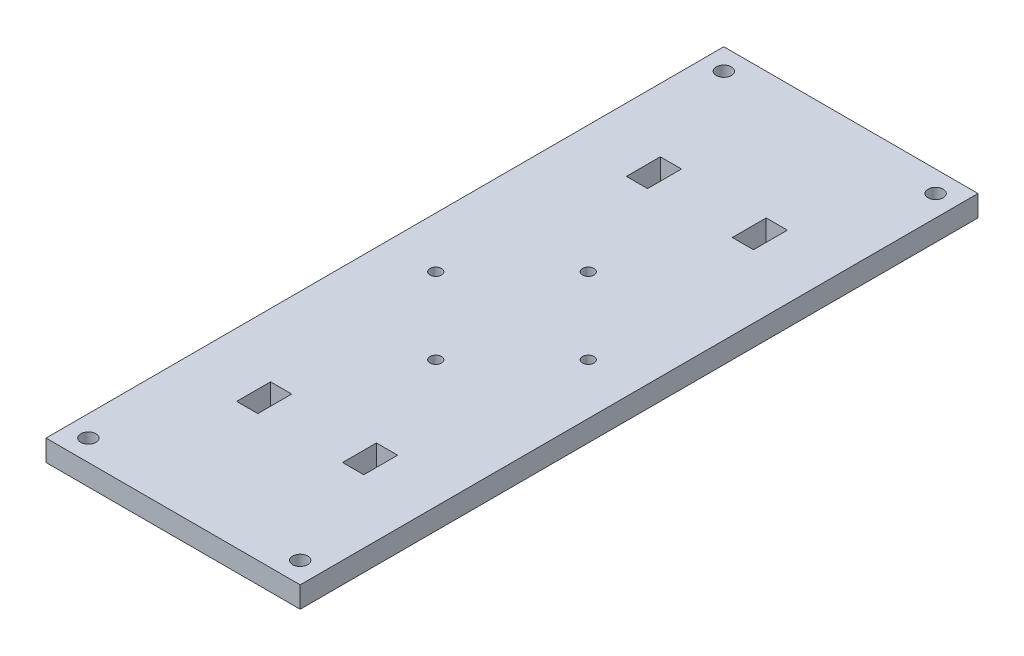
ISO-10303-21;
HEADER;
FILE_DESCRIPTION(('STEP AP214'),'2;1');
FILE_NAME('part.step','',(''),(''),'','','');
FILE_SCHEMA(('AUTOMOTIVE_DESIGN { 1 0 10303 214 1 1 1 1 }'));
ENDSEC;
DATA;
#1=APPLICATION_CONTEXT('core data for automotive mechanical design processes');
#2=APPLICATION_PROTOCOL_DEFINITION('international standard','automotive_design',2000,#1);
#3=PRODUCT_CONTEXT('',#1,'mechanical');
#4=PRODUCT('Part','Part','',(#3));
#5=PRODUCT_RELATED_PRODUCT_CATEGORY('part','',(#4));
#6=PRODUCT_DEFINITION_FORMATION('','',#4);
#7=PRODUCT_DEFINITION_CONTEXT('part definition',#1,'design');
#8=PRODUCT_DEFINITION('design','',#6,#7);
#9=PRODUCT_DEFINITION_SHAPE('','',#8);
#10=(LENGTH_UNIT() NAMED_UNIT(*) SI_UNIT(.MILLI.,.METRE.));
#11=(NAMED_UNIT(*) PLANE_ANGLE_UNIT() SI_UNIT($,.RADIAN.));
#12=(NAMED_UNIT(*) SI_UNIT($,.STERADIAN.) SOLID_ANGLE_UNIT());
#13=UNCERTAINTY_MEASURE_WITH_UNIT(LENGTH_MEASURE(1.E-05),#10,'distance_accuracy_value','');
#14=(GEOMETRIC_REPRESENTATION_CONTEXT(3) GLOBAL_UNCERTAINTY_ASSIGNED_CONTEXT((#13)) GLOBAL_UNIT_ASSIGNED_CONTEXT((#10,
#11,#12)) REPRESENTATION_CONTEXT('',''));
#15=CARTESIAN_POINT('',(0.,0.,0.));
#16=DIRECTION('',(0.,0.,1.));
#17=DIRECTION('',(1.,0.,0.));
#18=AXIS2_PLACEMENT_3D('',#15,#16,#17);
#19=CARTESIAN_POINT('',(-22.707182320442,5.,-67.3756906077348));
#20=DIRECTION('',(1.,0.,0.));
#21=DIRECTION('',(0.,0.,-1.));
#22=AXIS2_PLACEMENT_3D('',#19,#20,#21);
#23=PLANE('',#22);
#24=DIRECTION('',(0.,0.,1.));
#25=VECTOR('',#24,1.);
#26=CARTESIAN_POINT('',(-22.707182320442,0.,-67.3756906077348));
#27=LINE('',#26,#25);
#28=CARTESIAN_POINT('',(-22.707182320442,0.,-67.3756906077348));
#29=VERTEX_POINT('',#28);
#30=CARTESIAN_POINT('',(-22.707182320442,0.,92.6243093922652));
#31=VERTEX_POINT('',#30);
#32=EDGE_CURVE('E350',#29,#31,#27,.T.);
#33=ORIENTED_EDGE('',*,*,#32,.T.);
#34=DIRECTION('',(0.,-1.,0.));
#35=VECTOR('',#34,1.);
#36=CARTESIAN_POINT('',(-22.707182320442,5.,92.6243093922652));
#37=LINE('',#36,#35);
#38=CARTESIAN_POINT('',(-22.707182320442,5.,92.6243093922652));
#39=VERTEX_POINT('',#38);
#40=EDGE_CURVE('E11',#39,#31,#37,.T.);
#41=ORIENTED_EDGE('',*,*,#40,.F.);
#42=DIRECTION('',(0.,0.,1.));
#43=VECTOR('',#42,1.);
#44=CARTESIAN_POINT('',(-22.707182320442,5.,-67.3756906077348));
#45=LINE('',#44,#43);
#46=CARTESIAN_POINT('',(-22.707182320442,5.,-67.3756906077348));
#47=VERTEX_POINT('',#46);
#48=EDGE_CURVE('E353',#47,#39,#45,.T.);
#49=ORIENTED_EDGE('',*,*,#48,.F.);
#50=DIRECTION('',(0.,-1.,0.));
#51=VECTOR('',#50,1.);
#52=CARTESIAN_POINT('',(-22.707182320442,5.,-67.3756906077348));
#53=LINE('',#52,#51);
#54=EDGE_CURVE('E365',#47,#29,#53,.T.);
#55=ORIENTED_EDGE('',*,*,#54,.T.);
#56=EDGE_LOOP('',(#33,#41,#49,#55));
#57=FACE_BOUND('',#56,.T.);
#58=ADVANCED_FACE('F33',(#57),#23,.F.);
#59=CARTESIAN_POINT('',(-22.707182320442,5.,92.6243093922652));
#60=DIRECTION('',(0.,0.,-1.));
#61=DIRECTION('',(-1.,0.,0.));
#62=AXIS2_PLACEMENT_3D('',#59,#60,#61);
#63=PLANE('',#62);
#64=DIRECTION('',(1.,0.,0.));
#65=VECTOR('',#64,1.);
#66=CARTESIAN_POINT('',(-22.707182320442,0.,92.6243093922652));
#67=LINE('',#66,#65);
#68=CARTESIAN_POINT('',(37.292817679558,0.,92.6243093922652));
#69=VERTEX_POINT('',#68);
#70=EDGE_CURVE('E368',#31,#69,#67,.T.);
#71=ORIENTED_EDGE('',*,*,#70,.T.);
#72=DIRECTION('',(0.,-1.,0.));
#73=VECTOR('',#72,1.);
#74=CARTESIAN_POINT('',(37.292817679558,5.,92.6243093922652));
#75=LINE('',#74,#73);
#76=CARTESIAN_POINT('',(37.292817679558,5.,92.6243093922652));
#77=VERTEX_POINT('',#76);
#78=EDGE_CURVE('E40',#77,#69,#75,.T.);
#79=ORIENTED_EDGE('',*,*,#78,.F.);
#80=DIRECTION('',(1.,0.,0.));
#81=VECTOR('',#80,1.);
#82=CARTESIAN_POINT('',(-22.707182320442,5.,92.6243093922652));
#83=LINE('',#82,#81);
#84=EDGE_CURVE('E356',#39,#77,#83,.T.);
#85=ORIENTED_EDGE('',*,*,#84,.F.);
#86=ORIENTED_EDGE('',*,*,#40,.T.);
#87=EDGE_LOOP('',(#71,#79,#85,#86));
#88=FACE_BOUND('',#87,.T.);
#89=ADVANCED_FACE('F384',(#88),#63,.F.);
#90=CARTESIAN_POINT('',(37.292817679558,5.,-67.3756906077348));
#91=DIRECTION('',(1.,0.,0.));
#92=DIRECTION('',(0.,0.,-1.));
#93=AXIS2_PLACEMENT_3D('',#90,#91,#92);
#94=PLANE('',#93);
#95=DIRECTION('',(0.,0.,1.));
#96=VECTOR('',#95,1.);
#97=CARTESIAN_POINT('',(37.292817679558,0.,-67.3756906077348));
#98=LINE('',#97,#96);
#99=CARTESIAN_POINT('',(37.292817679558,0.,-67.3756906077348));
#100=VERTEX_POINT('',#99);
#101=EDGE_CURVE('E371',#100,#69,#98,.T.);
#102=ORIENTED_EDGE('',*,*,#101,.F.);
#103=DIRECTION('',(0.,-1.,0.));
#104=VECTOR('',#103,1.);
#105=CARTESIAN_POINT('',(37.292817679558,5.,-67.3756906077348));
#106=LINE('',#105,#104);
#107=CARTESIAN_POINT('',(37.292817679558,5.,-67.3756906077348));
#108=VERTEX_POINT('',#107);
#109=EDGE_CURVE('E377',#108,#100,#106,.T.);
#110=ORIENTED_EDGE('',*,*,#109,.F.);
#111=DIRECTION('',(0.,0.,1.));
#112=VECTOR('',#111,1.);
#113=CARTESIAN_POINT('',(37.292817679558,5.,-67.3756906077348));
#114=LINE('',#113,#112);
#115=EDGE_CURVE('E359',#108,#77,#114,.T.);
#116=ORIENTED_EDGE('',*,*,#115,.T.);
#117=ORIENTED_EDGE('',*,*,#78,.T.);
#118=EDGE_LOOP('',(#102,#110,#116,#117));
#119=FACE_BOUND('',#118,.T.);
#120=ADVANCED_FACE('F381',(#119),#94,.T.);
#121=CARTESIAN_POINT('',(-22.707182320442,5.,-67.3756906077348));
#122=DIRECTION('',(0.,0.,-1.));
#123=DIRECTION('',(-1.,0.,0.));
#124=AXIS2_PLACEMENT_3D('',#121,#122,#123);
#125=PLANE('',#124);
#126=DIRECTION('',(1.,0.,0.));
#127=VECTOR('',#126,1.);
#128=CARTESIAN_POINT('',(-22.707182320442,0.,-67.3756906077348));
#129=LINE('',#128,#127);
#130=EDGE_CURVE('E357',#29,#100,#129,.T.);
#131=ORIENTED_EDGE('',*,*,#130,.F.);
#132=ORIENTED_EDGE('',*,*,#54,.F.);
#133=DIRECTION('',(1.,0.,0.));
#134=VECTOR('',#133,1.);
#135=CARTESIAN_POINT('',(-22.707182320442,5.,-67.3756906077348));
#136=LINE('',#135,#134);
#137=EDGE_CURVE('E362',#47,#108,#136,.T.);
#138=ORIENTED_EDGE('',*,*,#137,.T.);
#139=ORIENTED_EDGE('',*,*,#109,.T.);
#140=EDGE_LOOP('',(#131,#132,#138,#139));
#141=FACE_BOUND('',#140,.T.);
#142=ADVANCED_FACE('F390',(#141),#125,.T.);
#143=CARTESIAN_POINT('',(0.,5.,0.));
#144=DIRECTION('',(0.,1.,0.));
#145=DIRECTION('',(0.,0.,1.));
#146=AXIS2_PLACEMENT_3D('',#143,#144,#145);
#147=PLANE('',#146);
#148=DIRECTION('',(0.,0.,-1.));
#149=VECTOR('',#148,1.);
#150=CARTESIAN_POINT('',(-2.70718232044199,5.,54.6243093922652));
#151=LINE('',#150,#149);
#152=CARTESIAN_POINT('',(-2.70718232044199,5.,62.6243093922652));
#153=VERTEX_POINT('',#152);
#154=CARTESIAN_POINT('',(-2.70718232044199,5.,54.6243093922652));
#155=VERTEX_POINT('',#154);
#156=EDGE_CURVE('E47',#153,#155,#151,.T.);
#157=ORIENTED_EDGE('',*,*,#156,.F.);
#158=DIRECTION('',(1.,0.,0.));
#159=VECTOR('',#158,1.);
#160=CARTESIAN_POINT('',(-2.70718232044199,5.,62.6243093922652));
#161=LINE('',#160,#159);
#162=CARTESIAN_POINT('',(-7.70718232044199,5.,62.6243093922652));
#163=VERTEX_POINT('',#162);
#164=EDGE_CURVE('E248',#163,#153,#161,.T.);
#165=ORIENTED_EDGE('',*,*,#164,.F.);
#166=DIRECTION('',(0.,0.,1.));
#167=VECTOR('',#166,1.);
#168=CARTESIAN_POINT('',(-7.70718232044199,5.,54.6243093922652));
#169=LINE('',#168,#167);
#170=CARTESIAN_POINT('',(-7.70718232044199,5.,54.6243093922652));
#171=VERTEX_POINT('',#170);
#172=EDGE_CURVE('E262',#171,#163,#169,.T.);
#173=ORIENTED_EDGE('',*,*,#172,.F.);
#174=DIRECTION('',(-1.,0.,0.));
#175=VECTOR('',#174,1.);
#176=CARTESIAN_POINT('',(-2.70718232044199,5.,54.6243093922652));
#177=LINE('',#176,#175);
#178=EDGE_CURVE('E259',#155,#171,#177,.T.);
#179=ORIENTED_EDGE('',*,*,#178,.F.);
#180=EDGE_LOOP('',(#157,#165,#173,#179));
#181=FACE_BOUND('',#180,.T.);
#182=DIRECTION('',(0.,0.,-1.));
#183=VECTOR('',#182,1.);
#184=CARTESIAN_POINT('',(22.292817679558,5.,62.6243093922652));
#185=LINE('',#184,#183);
#186=CARTESIAN_POINT('',(22.292817679558,5.,62.6243093922652));
#187=VERTEX_POINT('',#186);
#188=CARTESIAN_POINT('',(22.292817679558,5.,54.6243093922652));
#189=VERTEX_POINT('',#188);
#190=EDGE_CURVE('E55',#187,#189,#185,.T.);
#191=ORIENTED_EDGE('',*,*,#190,.F.);
#192=DIRECTION('',(1.,0.,0.));
#193=VECTOR('',#192,1.);
#194=CARTESIAN_POINT('',(22.292817679558,5.,62.6243093922652));
#195=LINE('',#194,#193);
#196=CARTESIAN_POINT('',(17.292817679558,5.,62.6243093922652));
#197=VERTEX_POINT('',#196);
#198=EDGE_CURVE('E218',#197,#187,#195,.T.);
#199=ORIENTED_EDGE('',*,*,#198,.F.);
#200=DIRECTION('',(0.,0.,1.));
#201=VECTOR('',#200,1.);
#202=CARTESIAN_POINT('',(17.292817679558,5.,62.6243093922652));
#203=LINE('',#202,#201);
#204=CARTESIAN_POINT('',(17.292817679558,5.,54.6243093922652));
#205=VERTEX_POINT('',#204);
#206=EDGE_CURVE('E233',#205,#197,#203,.T.);
#207=ORIENTED_EDGE('',*,*,#206,.F.);
#208=DIRECTION('',(-1.,0.,0.));
#209=VECTOR('',#208,1.);
#210=CARTESIAN_POINT('',(22.292817679558,5.,54.6243093922652));
#211=LINE('',#210,#209);
#212=EDGE_CURVE('E229',#189,#205,#211,.T.);
#213=ORIENTED_EDGE('',*,*,#212,.F.);
#214=EDGE_LOOP('',(#191,#199,#207,#213));
#215=FACE_BOUND('',#214,.T.);
#216=DIRECTION('',(0.,0.,1.));
#217=VECTOR('',#216,1.);
#218=CARTESIAN_POINT('',(17.292817679558,5.,-37.3756906077348));
#219=LINE('',#218,#217);
#220=CARTESIAN_POINT('',(17.292817679558,5.,-37.3756906077348));
#221=VERTEX_POINT('',#220);
#222=CARTESIAN_POINT('',(17.292817679558,5.,-29.3756906077348));
#223=VERTEX_POINT('',#222);
#224=EDGE_CURVE('E176',#221,#223,#219,.T.);
#225=ORIENTED_EDGE('',*,*,#224,.F.);
#226=DIRECTION('',(-1.,0.,0.));
#227=VECTOR('',#226,1.);
#228=CARTESIAN_POINT('',(17.292817679558,5.,-37.3756906077348));
#229=LINE('',#228,#227);
#230=CARTESIAN_POINT('',(22.292817679558,5.,-37.3756906077348));
#231=VERTEX_POINT('',#230);
#232=EDGE_CURVE('E194',#231,#221,#229,.T.);
#233=ORIENTED_EDGE('',*,*,#232,.F.);
#234=DIRECTION('',(0.,0.,-1.));
#235=VECTOR('',#234,1.);
#236=CARTESIAN_POINT('',(22.292817679558,5.,-37.3756906077348));
#237=LINE('',#236,#235);
#238=CARTESIAN_POINT('',(22.292817679558,5.,-29.3756906077348));
#239=VERTEX_POINT('',#238);
#240=EDGE_CURVE('E197',#239,#231,#237,.T.);
#241=ORIENTED_EDGE('',*,*,#240,.F.);
#242=DIRECTION('',(1.,0.,0.));
#243=VECTOR('',#242,1.);
#244=CARTESIAN_POINT('',(17.292817679558,5.,-29.3756906077348));
#245=LINE('',#244,#243);
#246=EDGE_CURVE('E203',#223,#239,#245,.T.);
#247=ORIENTED_EDGE('',*,*,#246,.F.);
#248=EDGE_LOOP('',(#225,#233,#241,#247));
#249=FACE_BOUND('',#248,.T.);
#250=DIRECTION('',(0.,0.,1.));
#251=VECTOR('',#250,1.);
#252=CARTESIAN_POINT('',(-7.70718232044199,5.,-37.3756906077348));
#253=LINE('',#252,#251);
#254=CARTESIAN_POINT('',(-7.70718232044199,5.,-37.3756906077348));
#255=VERTEX_POINT('',#254);
#256=CARTESIAN_POINT('',(-7.70718232044199,5.,-29.3756906077348));
#257=VERTEX_POINT('',#256);
#258=EDGE_CURVE('E210',#255,#257,#253,.T.);
#259=ORIENTED_EDGE('',*,*,#258,.F.);
#260=DIRECTION('',(-1.,0.,0.));
#261=VECTOR('',#260,1.);
#262=CARTESIAN_POINT('',(-7.70718232044199,5.,-37.3756906077348));
#263=LINE('',#262,#261);
#264=CARTESIAN_POINT('',(-2.70718232044199,5.,-37.3756906077348));
#265=VERTEX_POINT('',#264);
#266=EDGE_CURVE('E277',#265,#255,#263,.T.);
#267=ORIENTED_EDGE('',*,*,#266,.F.);
#268=DIRECTION('',(0.,0.,-1.));
#269=VECTOR('',#268,1.);
#270=CARTESIAN_POINT('',(-2.70718232044199,5.,-37.3756906077348));
#271=LINE('',#270,#269);
#272=CARTESIAN_POINT('',(-2.70718232044199,5.,-29.3756906077348));
#273=VERTEX_POINT('',#272);
#274=EDGE_CURVE('E291',#273,#265,#271,.T.);
#275=ORIENTED_EDGE('',*,*,#274,.F.);
#276=DIRECTION('',(1.,0.,0.));
#277=VECTOR('',#276,1.);
#278=CARTESIAN_POINT('',(-7.70718232044199,5.,-29.3756906077348));
#279=LINE('',#278,#277);
#280=EDGE_CURVE('E288',#257,#273,#279,.T.);
#281=ORIENTED_EDGE('',*,*,#280,.F.);
#282=EDGE_LOOP('',(#259,#267,#275,#281));
#283=FACE_BOUND('',#282,.T.);
#284=CARTESIAN_POINT('',(-10.707182320442,5.,12.6243093922652));
#285=DIRECTION('',(0.,1.,0.));
#286=DIRECTION('',(0.,0.,1.));
#287=AXIS2_PLACEMENT_3D('',#284,#285,#286);
#288=CIRCLE('',#287,1.35);
#289=CARTESIAN_POINT('',(-10.707182320442,5.,13.9743093922652));
#290=VERTEX_POINT('',#289);
#291=EDGE_CURVE('E309',#290,#290,#288,.T.);
#292=ORIENTED_EDGE('',*,*,#291,.F.);
#293=EDGE_LOOP('',(#292));
#294=FACE_BOUND('',#293,.T.);
#295=CARTESIAN_POINT('',(25.292817679558,5.,12.6243093922652));
#296=DIRECTION('',(0.,1.,0.));
#297=DIRECTION('',(0.,0.,1.));
#298=AXIS2_PLACEMENT_3D('',#295,#296,#297);
#299=CIRCLE('',#298,1.35);
#300=CARTESIAN_POINT('',(25.292817679558,5.,13.9743093922652));
#301=VERTEX_POINT('',#300);
#302=EDGE_CURVE('E315',#301,#301,#299,.T.);
#303=ORIENTED_EDGE('',*,*,#302,.F.);
#304=EDGE_LOOP('',(#303));
#305=FACE_BOUND('',#304,.T.);
#306=CARTESIAN_POINT('',(7.29281767955801,5.,-5.37569060773482));
#307=DIRECTION('',(0.,1.,0.));
#308=DIRECTION('',(0.,0.,1.));
#309=AXIS2_PLACEMENT_3D('',#306,#307,#308);
#310=CIRCLE('',#309,1.35);
#311=CARTESIAN_POINT('',(7.29281767955801,5.,-4.02569060773482));
#312=VERTEX_POINT('',#311);
#313=EDGE_CURVE('E321',#312,#312,#310,.T.);
#314=ORIENTED_EDGE('',*,*,#313,.F.);
#315=EDGE_LOOP('',(#314));
#316=FACE_BOUND('',#315,.T.);
#317=CARTESIAN_POINT('',(7.29281767955801,5.,30.6243093922652));
#318=DIRECTION('',(0.,1.,0.));
#319=DIRECTION('',(0.,0.,1.));
#320=AXIS2_PLACEMENT_3D('',#317,#318,#319);
#321=CIRCLE('',#320,1.35);
#322=CARTESIAN_POINT('',(7.29281767955801,5.,31.9743093922652));
#323=VERTEX_POINT('',#322);
#324=EDGE_CURVE('E298',#323,#323,#321,.T.);
#325=ORIENTED_EDGE('',*,*,#324,.F.);
#326=EDGE_LOOP('',(#325));
#327=FACE_BOUND('',#326,.T.);
#328=CARTESIAN_POINT('',(-17.707182320442,5.,87.6243093922652));
#329=DIRECTION('',(0.,1.,0.));
#330=DIRECTION('',(0.,0.,1.));
#331=AXIS2_PLACEMENT_3D('',#328,#329,#330);
#332=CIRCLE('',#331,1.78000000000001);
#333=CARTESIAN_POINT('',(-17.707182320442,5.,89.4043093922652));
#334=VERTEX_POINT('',#333);
#335=EDGE_CURVE('E308',#334,#334,#332,.T.);
#336=ORIENTED_EDGE('',*,*,#335,.F.);
#337=EDGE_LOOP('',(#336));
#338=FACE_BOUND('',#337,.T.);
#339=CARTESIAN_POINT('',(32.292817679558,5.,87.6243093922652));
#340=DIRECTION('',(0.,1.,0.));
#341=DIRECTION('',(0.,0.,1.));
#342=AXIS2_PLACEMENT_3D('',#339,#340,#341);
#343=CIRCLE('',#342,1.78);
#344=CARTESIAN_POINT('',(32.292817679558,5.,89.4043093922652));
#345=VERTEX_POINT('',#344);
#346=EDGE_CURVE('E339',#345,#345,#343,.T.);
#347=ORIENTED_EDGE('',*,*,#346,.F.);
#348=EDGE_LOOP('',(#347));
#349=FACE_BOUND('',#348,.T.);
#350=CARTESIAN_POINT('',(32.292817679558,5.,-62.3756906077348));
#351=DIRECTION('',(0.,1.,0.));
#352=DIRECTION('',(0.,0.,1.));
#353=AXIS2_PLACEMENT_3D('',#350,#351,#352);
#354=CIRCLE('',#353,1.78);
#355=CARTESIAN_POINT('',(32.292817679558,5.,-60.5956906077348));
#356=VERTEX_POINT('',#355);
#357=EDGE_CURVE('E333',#356,#356,#354,.T.);
#358=ORIENTED_EDGE('',*,*,#357,.F.);
#359=EDGE_LOOP('',(#358));
#360=FACE_BOUND('',#359,.T.);
#361=CARTESIAN_POINT('',(-17.707182320442,5.,-62.3756906077348));
#362=DIRECTION('',(0.,1.,0.));
#363=DIRECTION('',(0.,0.,1.));
#364=AXIS2_PLACEMENT_3D('',#361,#362,#363);
#365=CIRCLE('',#364,1.78);
#366=CARTESIAN_POINT('',(-17.707182320442,5.,-60.5956906077348));
#367=VERTEX_POINT('',#366);
#368=EDGE_CURVE('E332',#367,#367,#365,.T.);
#369=ORIENTED_EDGE('',*,*,#368,.F.);
#370=EDGE_LOOP('',(#369));
#371=FACE_BOUND('',#370,.T.);
#372=ORIENTED_EDGE('',*,*,#48,.T.);
#373=ORIENTED_EDGE('',*,*,#84,.T.);
#374=ORIENTED_EDGE('',*,*,#115,.F.);
#375=ORIENTED_EDGE('',*,*,#137,.F.);
#376=EDGE_LOOP('',(#372,#373,#374,#375));
#377=FACE_BOUND('',#376,.T.);
#378=ADVANCED_FACE('F394',(#181,#215,#249,#283,#294,#305,#316,#327,#338,#349,#360,#371,#377),
#147,.T.);
#379=CARTESIAN_POINT('',(0.,0.,0.));
#380=DIRECTION('',(0.,1.,0.));
#381=DIRECTION('',(0.,0.,1.));
#382=AXIS2_PLACEMENT_3D('',#379,#380,#381);
#383=PLANE('',#382);
#384=DIRECTION('',(1.,0.,0.));
#385=VECTOR('',#384,1.);
#386=CARTESIAN_POINT('',(-2.70718232044199,0.,62.6243093922652));
#387=LINE('',#386,#385);
#388=CARTESIAN_POINT('',(-7.70718232044199,0.,62.6243093922652));
#389=VERTEX_POINT('',#388);
#390=CARTESIAN_POINT('',(-2.70718232044199,0.,62.6243093922652));
#391=VERTEX_POINT('',#390);
#392=EDGE_CURVE('E254',#389,#391,#387,.T.);
#393=ORIENTED_EDGE('',*,*,#392,.T.);
#394=DIRECTION('',(0.,0.,-1.));
#395=VECTOR('',#394,1.);
#396=CARTESIAN_POINT('',(-2.70718232044199,0.,54.6243093922652));
#397=LINE('',#396,#395);
#398=CARTESIAN_POINT('',(-2.70718232044199,0.,54.6243093922652));
#399=VERTEX_POINT('',#398);
#400=EDGE_CURVE('E244',#391,#399,#397,.T.);
#401=ORIENTED_EDGE('',*,*,#400,.T.);
#402=DIRECTION('',(-1.,0.,0.));
#403=VECTOR('',#402,1.);
#404=CARTESIAN_POINT('',(-2.70718232044199,0.,54.6243093922652));
#405=LINE('',#404,#403);
#406=CARTESIAN_POINT('',(-7.70718232044199,0.,54.6243093922652));
#407=VERTEX_POINT('',#406);
#408=EDGE_CURVE('E247',#399,#407,#405,.T.);
#409=ORIENTED_EDGE('',*,*,#408,.T.);
#410=DIRECTION('',(0.,0.,1.));
#411=VECTOR('',#410,1.);
#412=CARTESIAN_POINT('',(-7.70718232044199,0.,54.6243093922652));
#413=LINE('',#412,#411);
#414=EDGE_CURVE('E251',#407,#389,#413,.T.);
#415=ORIENTED_EDGE('',*,*,#414,.T.);
#416=EDGE_LOOP('',(#393,#401,#409,#415));
#417=FACE_BOUND('',#416,.T.);
#418=DIRECTION('',(1.,0.,0.));
#419=VECTOR('',#418,1.);
#420=CARTESIAN_POINT('',(22.292817679558,0.,62.6243093922652));
#421=LINE('',#420,#419);
#422=CARTESIAN_POINT('',(17.292817679558,0.,62.6243093922652));
#423=VERTEX_POINT('',#422);
#424=CARTESIAN_POINT('',(22.292817679558,0.,62.6243093922652));
#425=VERTEX_POINT('',#424);
#426=EDGE_CURVE('E224',#423,#425,#421,.T.);
#427=ORIENTED_EDGE('',*,*,#426,.T.);
#428=DIRECTION('',(0.,0.,-1.));
#429=VECTOR('',#428,1.);
#430=CARTESIAN_POINT('',(22.292817679558,0.,62.6243093922652));
#431=LINE('',#430,#429);
#432=CARTESIAN_POINT('',(22.292817679558,0.,54.6243093922652));
#433=VERTEX_POINT('',#432);
#434=EDGE_CURVE('E214',#425,#433,#431,.T.);
#435=ORIENTED_EDGE('',*,*,#434,.T.);
#436=DIRECTION('',(-1.,0.,0.));
#437=VECTOR('',#436,1.);
#438=CARTESIAN_POINT('',(22.292817679558,0.,54.6243093922652));
#439=LINE('',#438,#437);
#440=CARTESIAN_POINT('',(17.292817679558,0.,54.6243093922652));
#441=VERTEX_POINT('',#440);
#442=EDGE_CURVE('E217',#433,#441,#439,.T.);
#443=ORIENTED_EDGE('',*,*,#442,.T.);
#444=DIRECTION('',(0.,0.,1.));
#445=VECTOR('',#444,1.);
#446=CARTESIAN_POINT('',(17.292817679558,0.,62.6243093922652));
#447=LINE('',#446,#445);
#448=EDGE_CURVE('E221',#441,#423,#447,.T.);
#449=ORIENTED_EDGE('',*,*,#448,.T.);
#450=EDGE_LOOP('',(#427,#435,#443,#449));
#451=FACE_BOUND('',#450,.T.);
#452=DIRECTION('',(-1.,0.,0.));
#453=VECTOR('',#452,1.);
#454=CARTESIAN_POINT('',(17.292817679558,0.,-37.3756906077348));
#455=LINE('',#454,#453);
#456=CARTESIAN_POINT('',(22.292817679558,0.,-37.3756906077348));
#457=VERTEX_POINT('',#456);
#458=CARTESIAN_POINT('',(17.292817679558,0.,-37.3756906077348));
#459=VERTEX_POINT('',#458);
#460=EDGE_CURVE('E181',#457,#459,#455,.T.);
#461=ORIENTED_EDGE('',*,*,#460,.T.);
#462=DIRECTION('',(0.,0.,1.));
#463=VECTOR('',#462,1.);
#464=CARTESIAN_POINT('',(17.292817679558,0.,-37.3756906077348));
#465=LINE('',#464,#463);
#466=CARTESIAN_POINT('',(17.292817679558,0.,-29.3756906077348));
#467=VERTEX_POINT('',#466);
#468=EDGE_CURVE('E173',#459,#467,#465,.T.);
#469=ORIENTED_EDGE('',*,*,#468,.T.);
#470=DIRECTION('',(1.,0.,0.));
#471=VECTOR('',#470,1.);
#472=CARTESIAN_POINT('',(17.292817679558,0.,-29.3756906077348));
#473=LINE('',#472,#471);
#474=CARTESIAN_POINT('',(22.292817679558,0.,-29.3756906077348));
#475=VERTEX_POINT('',#474);
#476=EDGE_CURVE('E185',#467,#475,#473,.T.);
#477=ORIENTED_EDGE('',*,*,#476,.T.);
#478=DIRECTION('',(0.,0.,-1.));
#479=VECTOR('',#478,1.);
#480=CARTESIAN_POINT('',(22.292817679558,0.,-37.3756906077348));
#481=LINE('',#480,#479);
#482=EDGE_CURVE('E189',#475,#457,#481,.T.);
#483=ORIENTED_EDGE('',*,*,#482,.T.);
#484=EDGE_LOOP('',(#461,#469,#477,#483));
#485=FACE_BOUND('',#484,.T.);
#486=DIRECTION('',(-1.,0.,0.));
#487=VECTOR('',#486,1.);
#488=CARTESIAN_POINT('',(-7.70718232044199,0.,-37.3756906077348));
#489=LINE('',#488,#487);
#490=CARTESIAN_POINT('',(-2.70718232044199,0.,-37.3756906077348));
#491=VERTEX_POINT('',#490);
#492=CARTESIAN_POINT('',(-7.70718232044199,0.,-37.3756906077348));
#493=VERTEX_POINT('',#492);
#494=EDGE_CURVE('E283',#491,#493,#489,.T.);
#495=ORIENTED_EDGE('',*,*,#494,.T.);
#496=DIRECTION('',(0.,0.,1.));
#497=VECTOR('',#496,1.);
#498=CARTESIAN_POINT('',(-7.70718232044199,0.,-37.3756906077348));
#499=LINE('',#498,#497);
#500=CARTESIAN_POINT('',(-7.70718232044199,0.,-29.3756906077348));
#501=VERTEX_POINT('',#500);
#502=EDGE_CURVE('E273',#493,#501,#499,.T.);
#503=ORIENTED_EDGE('',*,*,#502,.T.);
#504=DIRECTION('',(1.,0.,0.));
#505=VECTOR('',#504,1.);
#506=CARTESIAN_POINT('',(-7.70718232044199,0.,-29.3756906077348));
#507=LINE('',#506,#505);
#508=CARTESIAN_POINT('',(-2.70718232044199,0.,-29.3756906077348));
#509=VERTEX_POINT('',#508);
#510=EDGE_CURVE('E276',#501,#509,#507,.T.);
#511=ORIENTED_EDGE('',*,*,#510,.T.);
#512=DIRECTION('',(0.,0.,-1.));
#513=VECTOR('',#512,1.);
#514=CARTESIAN_POINT('',(-2.70718232044199,0.,-37.3756906077348));
#515=LINE('',#514,#513);
#516=EDGE_CURVE('E280',#509,#491,#515,.T.);
#517=ORIENTED_EDGE('',*,*,#516,.T.);
#518=EDGE_LOOP('',(#495,#503,#511,#517));
#519=FACE_BOUND('',#518,.T.);
#520=CARTESIAN_POINT('',(-10.707182320442,0.,12.6243093922652));
#521=DIRECTION('',(0.,1.,0.));
#522=DIRECTION('',(0.,0.,1.));
#523=AXIS2_PLACEMENT_3D('',#520,#521,#522);
#524=CIRCLE('',#523,1.35);
#525=CARTESIAN_POINT('',(-10.707182320442,0.,13.9743093922652));
#526=VERTEX_POINT('',#525);
#527=EDGE_CURVE('E305',#526,#526,#524,.T.);
#528=ORIENTED_EDGE('',*,*,#527,.T.);
#529=EDGE_LOOP('',(#528));
#530=FACE_BOUND('',#529,.T.);
#531=CARTESIAN_POINT('',(25.292817679558,0.,12.6243093922652));
#532=DIRECTION('',(0.,1.,0.));
#533=DIRECTION('',(0.,0.,1.));
#534=AXIS2_PLACEMENT_3D('',#531,#532,#533);
#535=CIRCLE('',#534,1.35);
#536=CARTESIAN_POINT('',(25.292817679558,0.,13.9743093922652));
#537=VERTEX_POINT('',#536);
#538=EDGE_CURVE('E312',#537,#537,#535,.T.);
#539=ORIENTED_EDGE('',*,*,#538,.T.);
#540=EDGE_LOOP('',(#539));
#541=FACE_BOUND('',#540,.T.);
#542=CARTESIAN_POINT('',(7.29281767955801,0.,-5.37569060773482));
#543=DIRECTION('',(0.,1.,0.));
#544=DIRECTION('',(0.,0.,1.));
#545=AXIS2_PLACEMENT_3D('',#542,#543,#544);
#546=CIRCLE('',#545,1.35);
#547=CARTESIAN_POINT('',(7.29281767955801,0.,-4.02569060773482));
#548=VERTEX_POINT('',#547);
#549=EDGE_CURVE('E318',#548,#548,#546,.T.);
#550=ORIENTED_EDGE('',*,*,#549,.T.);
#551=EDGE_LOOP('',(#550));
#552=FACE_BOUND('',#551,.T.);
#553=CARTESIAN_POINT('',(7.29281767955801,0.,30.6243093922652));
#554=DIRECTION('',(0.,1.,0.));
#555=DIRECTION('',(0.,0.,1.));
#556=AXIS2_PLACEMENT_3D('',#553,#554,#555);
#557=CIRCLE('',#556,1.35);
#558=CARTESIAN_POINT('',(7.29281767955801,0.,31.9743093922652));
#559=VERTEX_POINT('',#558);
#560=EDGE_CURVE('E324',#559,#559,#557,.T.);
#561=ORIENTED_EDGE('',*,*,#560,.T.);
#562=EDGE_LOOP('',(#561));
#563=FACE_BOUND('',#562,.T.);
#564=CARTESIAN_POINT('',(-17.707182320442,0.,87.6243093922652));
#565=DIRECTION('',(0.,1.,0.));
#566=DIRECTION('',(0.,0.,1.));
#567=AXIS2_PLACEMENT_3D('',#564,#565,#566);
#568=CIRCLE('',#567,1.78000000000001);
#569=CARTESIAN_POINT('',(-17.707182320442,0.,89.4043093922652));
#570=VERTEX_POINT('',#569);
#571=EDGE_CURVE('E342',#570,#570,#568,.T.);
#572=ORIENTED_EDGE('',*,*,#571,.T.);
#573=EDGE_LOOP('',(#572));
#574=FACE_BOUND('',#573,.T.);
#575=CARTESIAN_POINT('',(32.292817679558,0.,87.6243093922652));
#576=DIRECTION('',(0.,1.,0.));
#577=DIRECTION('',(0.,0.,1.));
#578=AXIS2_PLACEMENT_3D('',#575,#576,#577);
#579=CIRCLE('',#578,1.78);
#580=CARTESIAN_POINT('',(32.292817679558,0.,89.4043093922652));
#581=VERTEX_POINT('',#580);
#582=EDGE_CURVE('E336',#581,#581,#579,.T.);
#583=ORIENTED_EDGE('',*,*,#582,.T.);
#584=EDGE_LOOP('',(#583));
#585=FACE_BOUND('',#584,.T.);
#586=CARTESIAN_POINT('',(32.292817679558,0.,-62.3756906077348));
#587=DIRECTION('',(0.,1.,0.));
#588=DIRECTION('',(0.,0.,1.));
#589=AXIS2_PLACEMENT_3D('',#586,#587,#588);
#590=CIRCLE('',#589,1.78);
#591=CARTESIAN_POINT('',(32.292817679558,0.,-60.5956906077348));
#592=VERTEX_POINT('',#591);
#593=EDGE_CURVE('E329',#592,#592,#590,.T.);
#594=ORIENTED_EDGE('',*,*,#593,.T.);
#595=EDGE_LOOP('',(#594));
#596=FACE_BOUND('',#595,.T.);
#597=CARTESIAN_POINT('',(-17.707182320442,0.,-62.3756906077348));
#598=DIRECTION('',(0.,1.,0.));
#599=DIRECTION('',(0.,0.,1.));
#600=AXIS2_PLACEMENT_3D('',#597,#598,#599);
#601=CIRCLE('',#600,1.78);
#602=CARTESIAN_POINT('',(-17.707182320442,0.,-60.5956906077348));
#603=VERTEX_POINT('',#602);
#604=EDGE_CURVE('E347',#603,#603,#601,.T.);
#605=ORIENTED_EDGE('',*,*,#604,.T.);
#606=EDGE_LOOP('',(#605));
#607=FACE_BOUND('',#606,.T.);
#608=ORIENTED_EDGE('',*,*,#32,.F.);
#609=ORIENTED_EDGE('',*,*,#130,.T.);
#610=ORIENTED_EDGE('',*,*,#101,.T.);
#611=ORIENTED_EDGE('',*,*,#70,.F.);
#612=EDGE_LOOP('',(#608,#609,#610,#611));
#613=FACE_BOUND('',#612,.T.);
#614=ADVANCED_FACE('F191',(#417,#451,#485,#519,#530,#541,#552,#563,#574,#585,#596,#607,#613),
#383,.F.);
#615=CARTESIAN_POINT('',(-17.707182320442,0.,-62.3756906077348));
#616=DIRECTION('',(0.,1.,0.));
#617=DIRECTION('',(0.,0.,1.));
#618=AXIS2_PLACEMENT_3D('',#615,#616,#617);
#619=CYLINDRICAL_SURFACE('',#618,1.78);
#620=ORIENTED_EDGE('',*,*,#604,.F.);
#621=EDGE_LOOP('',(#620));
#622=FACE_BOUND('',#621,.T.);
#623=ORIENTED_EDGE('',*,*,#368,.T.);
#624=EDGE_LOOP('',(#623));
#625=FACE_BOUND('',#624,.T.);
#626=ADVANCED_FACE('F409',(#622,#625),#619,.F.);
#627=CARTESIAN_POINT('',(32.292817679558,0.,-62.3756906077348));
#628=DIRECTION('',(0.,1.,0.));
#629=DIRECTION('',(0.,0.,1.));
#630=AXIS2_PLACEMENT_3D('',#627,#628,#629);
#631=CYLINDRICAL_SURFACE('',#630,1.78);
#632=ORIENTED_EDGE('',*,*,#593,.F.);
#633=EDGE_LOOP('',(#632));
#634=FACE_BOUND('',#633,.T.);
#635=ORIENTED_EDGE('',*,*,#357,.T.);
#636=EDGE_LOOP('',(#635));
#637=FACE_BOUND('',#636,.T.);
#638=ADVANCED_FACE('F416',(#634,#637),#631,.F.);
#639=CARTESIAN_POINT('',(32.292817679558,0.,87.6243093922652));
#640=DIRECTION('',(0.,1.,0.));
#641=DIRECTION('',(0.,0.,1.));
#642=AXIS2_PLACEMENT_3D('',#639,#640,#641);
#643=CYLINDRICAL_SURFACE('',#642,1.78);
#644=ORIENTED_EDGE('',*,*,#582,.F.);
#645=EDGE_LOOP('',(#644));
#646=FACE_BOUND('',#645,.T.);
#647=ORIENTED_EDGE('',*,*,#346,.T.);
#648=EDGE_LOOP('',(#647));
#649=FACE_BOUND('',#648,.T.);
#650=ADVANCED_FACE('F422',(#646,#649),#643,.F.);
#651=CARTESIAN_POINT('',(-17.707182320442,0.,87.6243093922652));
#652=DIRECTION('',(0.,1.,0.));
#653=DIRECTION('',(0.,0.,1.));
#654=AXIS2_PLACEMENT_3D('',#651,#652,#653);
#655=CYLINDRICAL_SURFACE('',#654,1.78000000000001);
#656=ORIENTED_EDGE('',*,*,#571,.F.);
#657=EDGE_LOOP('',(#656));
#658=FACE_BOUND('',#657,.T.);
#659=ORIENTED_EDGE('',*,*,#335,.T.);
#660=EDGE_LOOP('',(#659));
#661=FACE_BOUND('',#660,.T.);
#662=ADVANCED_FACE('F418',(#658,#661),#655,.F.);
#663=CARTESIAN_POINT('',(7.29281767955801,0.,30.6243093922652));
#664=DIRECTION('',(0.,1.,0.));
#665=DIRECTION('',(0.,0.,1.));
#666=AXIS2_PLACEMENT_3D('',#663,#664,#665);
#667=CYLINDRICAL_SURFACE('',#666,1.35);
#668=ORIENTED_EDGE('',*,*,#560,.F.);
#669=EDGE_LOOP('',(#668));
#670=FACE_BOUND('',#669,.T.);
#671=ORIENTED_EDGE('',*,*,#324,.T.);
#672=EDGE_LOOP('',(#671));
#673=FACE_BOUND('',#672,.T.);
#674=ADVANCED_FACE('F421',(#670,#673),#667,.F.);
#675=CARTESIAN_POINT('',(7.29281767955801,0.,-5.37569060773482));
#676=DIRECTION('',(0.,1.,0.));
#677=DIRECTION('',(0.,0.,1.));
#678=AXIS2_PLACEMENT_3D('',#675,#676,#677);
#679=CYLINDRICAL_SURFACE('',#678,1.35);
#680=ORIENTED_EDGE('',*,*,#549,.F.);
#681=EDGE_LOOP('',(#680));
#682=FACE_BOUND('',#681,.T.);
#683=ORIENTED_EDGE('',*,*,#313,.T.);
#684=EDGE_LOOP('',(#683));
#685=FACE_BOUND('',#684,.T.);
#686=ADVANCED_FACE('F432',(#682,#685),#679,.F.);
#687=CARTESIAN_POINT('',(25.292817679558,0.,12.6243093922652));
#688=DIRECTION('',(0.,1.,0.));
#689=DIRECTION('',(0.,0.,1.));
#690=AXIS2_PLACEMENT_3D('',#687,#688,#689);
#691=CYLINDRICAL_SURFACE('',#690,1.35);
#692=ORIENTED_EDGE('',*,*,#538,.F.);
#693=EDGE_LOOP('',(#692));
#694=FACE_BOUND('',#693,.T.);
#695=ORIENTED_EDGE('',*,*,#302,.T.);
#696=EDGE_LOOP('',(#695));
#697=FACE_BOUND('',#696,.T.);
#698=ADVANCED_FACE('F436',(#694,#697),#691,.F.);
#699=CARTESIAN_POINT('',(-10.707182320442,0.,12.6243093922652));
#700=DIRECTION('',(0.,1.,0.));
#701=DIRECTION('',(0.,0.,1.));
#702=AXIS2_PLACEMENT_3D('',#699,#700,#701);
#703=CYLINDRICAL_SURFACE('',#702,1.35);
#704=ORIENTED_EDGE('',*,*,#527,.F.);
#705=EDGE_LOOP('',(#704));
#706=FACE_BOUND('',#705,.T.);
#707=ORIENTED_EDGE('',*,*,#291,.T.);
#708=EDGE_LOOP('',(#707));
#709=FACE_BOUND('',#708,.T.);
#710=ADVANCED_FACE('F440',(#706,#709),#703,.F.);
#711=CARTESIAN_POINT('',(-7.70718232044199,0.,-37.3756906077348));
#712=DIRECTION('',(-1.,0.,0.));
#713=DIRECTION('',(0.,0.,1.));
#714=AXIS2_PLACEMENT_3D('',#711,#712,#713);
#715=PLANE('',#714);
#716=ORIENTED_EDGE('',*,*,#258,.T.);
#717=DIRECTION('',(0.,1.,0.));
#718=VECTOR('',#717,1.);
#719=CARTESIAN_POINT('',(-7.70718232044199,0.,-29.3756906077348));
#720=LINE('',#719,#718);
#721=EDGE_CURVE('E286',#501,#257,#720,.T.);
#722=ORIENTED_EDGE('',*,*,#721,.F.);
#723=ORIENTED_EDGE('',*,*,#502,.F.);
#724=DIRECTION('',(0.,1.,0.));
#725=VECTOR('',#724,1.);
#726=CARTESIAN_POINT('',(-7.70718232044199,0.,-37.3756906077348));
#727=LINE('',#726,#725);
#728=EDGE_CURVE('E296',#493,#255,#727,.T.);
#729=ORIENTED_EDGE('',*,*,#728,.T.);
#730=EDGE_LOOP('',(#716,#722,#723,#729));
#731=FACE_BOUND('',#730,.T.);
#732=ADVANCED_FACE('F444',(#731),#715,.F.);
#733=CARTESIAN_POINT('',(-7.70718232044199,0.,-37.3756906077348));
#734=DIRECTION('',(0.,0.,-1.));
#735=DIRECTION('',(-1.,0.,0.));
#736=AXIS2_PLACEMENT_3D('',#733,#734,#735);
#737=PLANE('',#736);
#738=ORIENTED_EDGE('',*,*,#266,.T.);
#739=ORIENTED_EDGE('',*,*,#728,.F.);
#740=ORIENTED_EDGE('',*,*,#494,.F.);
#741=DIRECTION('',(0.,1.,0.));
#742=VECTOR('',#741,1.);
#743=CARTESIAN_POINT('',(-2.70718232044199,0.,-37.3756906077348));
#744=LINE('',#743,#742);
#745=EDGE_CURVE('E299',#491,#265,#744,.T.);
#746=ORIENTED_EDGE('',*,*,#745,.T.);
#747=EDGE_LOOP('',(#738,#739,#740,#746));
#748=FACE_BOUND('',#747,.T.);
#749=ADVANCED_FACE('F448',(#748),#737,.F.);
#750=CARTESIAN_POINT('',(-2.70718232044199,0.,-37.3756906077348));
#751=DIRECTION('',(1.,0.,0.));
#752=DIRECTION('',(0.,0.,-1.));
#753=AXIS2_PLACEMENT_3D('',#750,#751,#752);
#754=PLANE('',#753);
#755=ORIENTED_EDGE('',*,*,#274,.T.);
#756=ORIENTED_EDGE('',*,*,#745,.F.);
#757=ORIENTED_EDGE('',*,*,#516,.F.);
#758=DIRECTION('',(0.,1.,0.));
#759=VECTOR('',#758,1.);
#760=CARTESIAN_POINT('',(-2.70718232044199,0.,-29.3756906077348));
#761=LINE('',#760,#759);
#762=EDGE_CURVE('E301',#509,#273,#761,.T.);
#763=ORIENTED_EDGE('',*,*,#762,.T.);
#764=EDGE_LOOP('',(#755,#756,#757,#763));
#765=FACE_BOUND('',#764,.T.);
#766=ADVANCED_FACE('F453',(#765),#754,.F.);
#767=CARTESIAN_POINT('',(-7.70718232044199,0.,-29.3756906077348));
#768=DIRECTION('',(0.,0.,1.));
#769=DIRECTION('',(1.,0.,0.));
#770=AXIS2_PLACEMENT_3D('',#767,#768,#769);
#771=PLANE('',#770);
#772=ORIENTED_EDGE('',*,*,#280,.T.);
#773=ORIENTED_EDGE('',*,*,#762,.F.);
#774=ORIENTED_EDGE('',*,*,#510,.F.);
#775=ORIENTED_EDGE('',*,*,#721,.T.);
#776=EDGE_LOOP('',(#772,#773,#774,#775));
#777=FACE_BOUND('',#776,.T.);
#778=ADVANCED_FACE('F450',(#777),#771,.F.);
#779=CARTESIAN_POINT('',(17.292817679558,0.,-37.3756906077348));
#780=DIRECTION('',(-1.,0.,0.));
#781=DIRECTION('',(0.,0.,1.));
#782=AXIS2_PLACEMENT_3D('',#779,#780,#781);
#783=PLANE('',#782);
#784=ORIENTED_EDGE('',*,*,#224,.T.);
#785=DIRECTION('',(0.,1.,0.));
#786=VECTOR('',#785,1.);
#787=CARTESIAN_POINT('',(17.292817679558,0.,-29.3756906077348));
#788=LINE('',#787,#786);
#789=EDGE_CURVE('E169',#467,#223,#788,.T.);
#790=ORIENTED_EDGE('',*,*,#789,.F.);
#791=ORIENTED_EDGE('',*,*,#468,.F.);
#792=DIRECTION('',(0.,1.,0.));
#793=VECTOR('',#792,1.);
#794=CARTESIAN_POINT('',(17.292817679558,0.,-37.3756906077348));
#795=LINE('',#794,#793);
#796=EDGE_CURVE('E208',#459,#221,#795,.T.);
#797=ORIENTED_EDGE('',*,*,#796,.T.);
#798=EDGE_LOOP('',(#784,#790,#791,#797));
#799=FACE_BOUND('',#798,.T.);
#800=ADVANCED_FACE('F171',(#799),#783,.F.);
#801=CARTESIAN_POINT('',(17.292817679558,0.,-37.3756906077348));
#802=DIRECTION('',(0.,0.,-1.));
#803=DIRECTION('',(-1.,0.,0.));
#804=AXIS2_PLACEMENT_3D('',#801,#802,#803);
#805=PLANE('',#804);
#806=ORIENTED_EDGE('',*,*,#232,.T.);
#807=ORIENTED_EDGE('',*,*,#796,.F.);
#808=ORIENTED_EDGE('',*,*,#460,.F.);
#809=DIRECTION('',(0.,1.,0.));
#810=VECTOR('',#809,1.);
#811=CARTESIAN_POINT('',(22.292817679558,0.,-37.3756906077348));
#812=LINE('',#811,#810);
#813=EDGE_CURVE('E211',#457,#231,#812,.T.);
#814=ORIENTED_EDGE('',*,*,#813,.T.);
#815=EDGE_LOOP('',(#806,#807,#808,#814));
#816=FACE_BOUND('',#815,.T.);
#817=ADVANCED_FACE('F493',(#816),#805,.F.);
#818=CARTESIAN_POINT('',(22.292817679558,0.,-37.3756906077348));
#819=DIRECTION('',(1.,0.,0.));
#820=DIRECTION('',(0.,0.,-1.));
#821=AXIS2_PLACEMENT_3D('',#818,#819,#820);
#822=PLANE('',#821);
#823=ORIENTED_EDGE('',*,*,#240,.T.);
#824=ORIENTED_EDGE('',*,*,#813,.F.);
#825=ORIENTED_EDGE('',*,*,#482,.F.);
#826=DIRECTION('',(0.,1.,0.));
#827=VECTOR('',#826,1.);
#828=CARTESIAN_POINT('',(22.292817679558,0.,-29.3756906077348));
#829=LINE('',#828,#827);
#830=EDGE_CURVE('E180',#475,#239,#829,.T.);
#831=ORIENTED_EDGE('',*,*,#830,.T.);
#832=EDGE_LOOP('',(#823,#824,#825,#831));
#833=FACE_BOUND('',#832,.T.);
#834=ADVANCED_FACE('F496',(#833),#822,.F.);
#835=CARTESIAN_POINT('',(17.292817679558,0.,-29.3756906077348));
#836=DIRECTION('',(0.,0.,1.));
#837=DIRECTION('',(1.,0.,0.));
#838=AXIS2_PLACEMENT_3D('',#835,#836,#837);
#839=PLANE('',#838);
#840=ORIENTED_EDGE('',*,*,#246,.T.);
#841=ORIENTED_EDGE('',*,*,#830,.F.);
#842=ORIENTED_EDGE('',*,*,#476,.F.);
#843=ORIENTED_EDGE('',*,*,#789,.T.);
#844=EDGE_LOOP('',(#840,#841,#842,#843));
#845=FACE_BOUND('',#844,.T.);
#846=ADVANCED_FACE('F186',(#845),#839,.F.);
#847=CARTESIAN_POINT('',(22.292817679558,0.,62.6243093922652));
#848=DIRECTION('',(1.,0.,0.));
#849=DIRECTION('',(0.,0.,-1.));
#850=AXIS2_PLACEMENT_3D('',#847,#848,#849);
#851=PLANE('',#850);
#852=ORIENTED_EDGE('',*,*,#190,.T.);
#853=DIRECTION('',(0.,1.,0.));
#854=VECTOR('',#853,1.);
#855=CARTESIAN_POINT('',(22.292817679558,0.,54.6243093922652));
#856=LINE('',#855,#854);
#857=EDGE_CURVE('E227',#433,#189,#856,.T.);
#858=ORIENTED_EDGE('',*,*,#857,.F.);
#859=ORIENTED_EDGE('',*,*,#434,.F.);
#860=DIRECTION('',(0.,1.,0.));
#861=VECTOR('',#860,1.);
#862=CARTESIAN_POINT('',(22.292817679558,0.,62.6243093922652));
#863=LINE('',#862,#861);
#864=EDGE_CURVE('E204',#425,#187,#863,.T.);
#865=ORIENTED_EDGE('',*,*,#864,.T.);
#866=EDGE_LOOP('',(#852,#858,#859,#865));
#867=FACE_BOUND('',#866,.T.);
#868=ADVANCED_FACE('F477',(#867),#851,.F.);
#869=CARTESIAN_POINT('',(22.292817679558,0.,62.6243093922652));
#870=DIRECTION('',(0.,0.,1.));
#871=DIRECTION('',(1.,0.,0.));
#872=AXIS2_PLACEMENT_3D('',#869,#870,#871);
#873=PLANE('',#872);
#874=ORIENTED_EDGE('',*,*,#198,.T.);
#875=ORIENTED_EDGE('',*,*,#864,.F.);
#876=ORIENTED_EDGE('',*,*,#426,.F.);
#877=DIRECTION('',(0.,1.,0.));
#878=VECTOR('',#877,1.);
#879=CARTESIAN_POINT('',(17.292817679558,0.,62.6243093922652));
#880=LINE('',#879,#878);
#881=EDGE_CURVE('E239',#423,#197,#880,.T.);
#882=ORIENTED_EDGE('',*,*,#881,.T.);
#883=EDGE_LOOP('',(#874,#875,#876,#882));
#884=FACE_BOUND('',#883,.T.);
#885=ADVANCED_FACE('F480',(#884),#873,.F.);
#886=CARTESIAN_POINT('',(17.292817679558,0.,62.6243093922652));
#887=DIRECTION('',(-1.,0.,0.));
#888=DIRECTION('',(0.,0.,1.));
#889=AXIS2_PLACEMENT_3D('',#886,#887,#888);
#890=PLANE('',#889);
#891=ORIENTED_EDGE('',*,*,#206,.T.);
#892=ORIENTED_EDGE('',*,*,#881,.F.);
#893=ORIENTED_EDGE('',*,*,#448,.F.);
#894=DIRECTION('',(0.,1.,0.));
#895=VECTOR('',#894,1.);
#896=CARTESIAN_POINT('',(17.292817679558,0.,54.6243093922652));
#897=LINE('',#896,#895);
#898=EDGE_CURVE('E241',#441,#205,#897,.T.);
#899=ORIENTED_EDGE('',*,*,#898,.T.);
#900=EDGE_LOOP('',(#891,#892,#893,#899));
#901=FACE_BOUND('',#900,.T.);
#902=ADVANCED_FACE('F483',(#901),#890,.F.);
#903=CARTESIAN_POINT('',(22.292817679558,0.,54.6243093922652));
#904=DIRECTION('',(0.,0.,-1.));
#905=DIRECTION('',(-1.,0.,0.));
#906=AXIS2_PLACEMENT_3D('',#903,#904,#905);
#907=PLANE('',#906);
#908=ORIENTED_EDGE('',*,*,#212,.T.);
#909=ORIENTED_EDGE('',*,*,#898,.F.);
#910=ORIENTED_EDGE('',*,*,#442,.F.);
#911=ORIENTED_EDGE('',*,*,#857,.T.);
#912=EDGE_LOOP('',(#908,#909,#910,#911));
#913=FACE_BOUND('',#912,.T.);
#914=ADVANCED_FACE('F465',(#913),#907,.F.);
#915=CARTESIAN_POINT('',(-2.70718232044199,0.,54.6243093922652));
#916=DIRECTION('',(1.,0.,0.));
#917=DIRECTION('',(0.,0.,-1.));
#918=AXIS2_PLACEMENT_3D('',#915,#916,#917);
#919=PLANE('',#918);
#920=ORIENTED_EDGE('',*,*,#156,.T.);
#921=DIRECTION('',(0.,1.,0.));
#922=VECTOR('',#921,1.);
#923=CARTESIAN_POINT('',(-2.70718232044199,0.,54.6243093922652));
#924=LINE('',#923,#922);
#925=EDGE_CURVE('E257',#399,#155,#924,.T.);
#926=ORIENTED_EDGE('',*,*,#925,.F.);
#927=ORIENTED_EDGE('',*,*,#400,.F.);
#928=DIRECTION('',(0.,1.,0.));
#929=VECTOR('',#928,1.);
#930=CARTESIAN_POINT('',(-2.70718232044199,0.,62.6243093922652));
#931=LINE('',#930,#929);
#932=EDGE_CURVE('E230',#391,#153,#931,.T.);
#933=ORIENTED_EDGE('',*,*,#932,.T.);
#934=EDGE_LOOP('',(#920,#926,#927,#933));
#935=FACE_BOUND('',#934,.T.);
#936=ADVANCED_FACE('F461',(#935),#919,.F.);
#937=CARTESIAN_POINT('',(-2.70718232044199,0.,62.6243093922652));
#938=DIRECTION('',(0.,0.,1.));
#939=DIRECTION('',(1.,0.,0.));
#940=AXIS2_PLACEMENT_3D('',#937,#938,#939);
#941=PLANE('',#940);
#942=ORIENTED_EDGE('',*,*,#164,.T.);
#943=ORIENTED_EDGE('',*,*,#932,.F.);
#944=ORIENTED_EDGE('',*,*,#392,.F.);
#945=DIRECTION('',(0.,1.,0.));
#946=VECTOR('',#945,1.);
#947=CARTESIAN_POINT('',(-7.70718232044199,0.,62.6243093922652));
#948=LINE('',#947,#946);
#949=EDGE_CURVE('E268',#389,#163,#948,.T.);
#950=ORIENTED_EDGE('',*,*,#949,.T.);
#951=EDGE_LOOP('',(#942,#943,#944,#950));
#952=FACE_BOUND('',#951,.T.);
#953=ADVANCED_FACE('F464',(#952),#941,.F.);
#954=CARTESIAN_POINT('',(-7.70718232044199,0.,54.6243093922652));
#955=DIRECTION('',(-1.,0.,0.));
#956=DIRECTION('',(0.,0.,1.));
#957=AXIS2_PLACEMENT_3D('',#954,#955,#956);
#958=PLANE('',#957);
#959=ORIENTED_EDGE('',*,*,#172,.T.);
#960=ORIENTED_EDGE('',*,*,#949,.F.);
#961=ORIENTED_EDGE('',*,*,#414,.F.);
#962=DIRECTION('',(0.,1.,0.));
#963=VECTOR('',#962,1.);
#964=CARTESIAN_POINT('',(-7.70718232044199,0.,54.6243093922652));
#965=LINE('',#964,#963);
#966=EDGE_CURVE('E270',#407,#171,#965,.T.);
#967=ORIENTED_EDGE('',*,*,#966,.T.);
#968=EDGE_LOOP('',(#959,#960,#961,#967));
#969=FACE_BOUND('',#968,.T.);
#970=ADVANCED_FACE('F469',(#969),#958,.F.);
#971=CARTESIAN_POINT('',(-2.70718232044199,0.,54.6243093922652));
#972=DIRECTION('',(0.,0.,-1.));
#973=DIRECTION('',(-1.,0.,0.));
#974=AXIS2_PLACEMENT_3D('',#971,#972,#973);
#975=PLANE('',#974);
#976=ORIENTED_EDGE('',*,*,#178,.T.);
#977=ORIENTED_EDGE('',*,*,#966,.F.);
#978=ORIENTED_EDGE('',*,*,#408,.F.);
#979=ORIENTED_EDGE('',*,*,#925,.T.);
#980=EDGE_LOOP('',(#976,#977,#978,#979));
#981=FACE_BOUND('',#980,.T.);
#982=ADVANCED_FACE('F466',(#981),#975,.F.);
#983=CLOSED_SHELL('',(#58,#89,#120,#142,#378,#614,#626,#638,#650,#662,#674,#686,#698,#710,#732,
#749,#766,#778,#800,#817,#834,#846,#868,#885,#902,#914,#936,#953,#970,#982));
#984=MANIFOLD_SOLID_BREP('B2',#983);
#985=ADVANCED_BREP_SHAPE_REPRESENTATION('',(#18,#984),#14);
#986=SHAPE_DEFINITION_REPRESENTATION(#9,#985);
ENDSEC;
END-ISO-10303-21;
